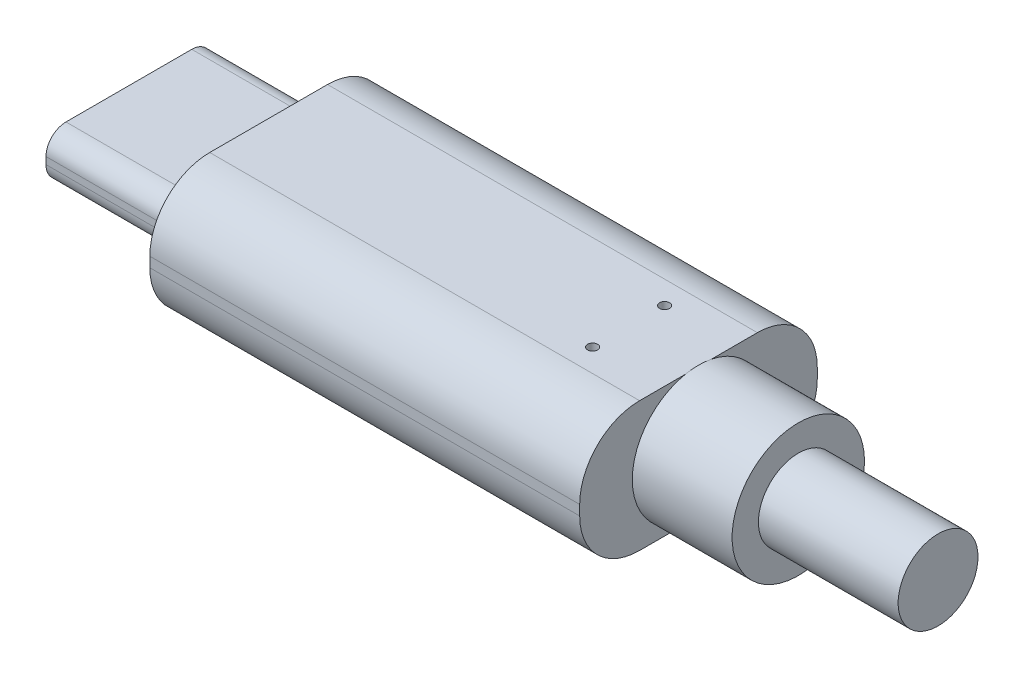
ISO-10303-21;
HEADER;
FILE_DESCRIPTION(('STEP AP214'),'2;1');
FILE_NAME('part.step','',(''),(''),'','','');
FILE_SCHEMA(('AUTOMOTIVE_DESIGN { 1 0 10303 214 1 1 1 1 }'));
ENDSEC;
DATA;
#1=APPLICATION_CONTEXT('core data for automotive mechanical design processes');
#2=APPLICATION_PROTOCOL_DEFINITION('international standard','automotive_design',2000,#1);
#3=PRODUCT_CONTEXT('',#1,'mechanical');
#4=PRODUCT('Part','Part','',(#3));
#5=PRODUCT_RELATED_PRODUCT_CATEGORY('part','',(#4));
#6=PRODUCT_DEFINITION_FORMATION('','',#4);
#7=PRODUCT_DEFINITION_CONTEXT('part definition',#1,'design');
#8=PRODUCT_DEFINITION('design','',#6,#7);
#9=PRODUCT_DEFINITION_SHAPE('','',#8);
#10=(LENGTH_UNIT() NAMED_UNIT(*) SI_UNIT(.MILLI.,.METRE.));
#11=(NAMED_UNIT(*) PLANE_ANGLE_UNIT() SI_UNIT($,.RADIAN.));
#12=(NAMED_UNIT(*) SI_UNIT($,.STERADIAN.) SOLID_ANGLE_UNIT());
#13=UNCERTAINTY_MEASURE_WITH_UNIT(LENGTH_MEASURE(1.E-05),#10,'distance_accuracy_value','');
#14=(GEOMETRIC_REPRESENTATION_CONTEXT(3) GLOBAL_UNCERTAINTY_ASSIGNED_CONTEXT((#13)) GLOBAL_UNIT_ASSIGNED_CONTEXT((#10,
#11,#12)) REPRESENTATION_CONTEXT('',''));
#15=CARTESIAN_POINT('',(0.,0.,0.));
#16=DIRECTION('',(0.,0.,1.));
#17=DIRECTION('',(1.,0.,0.));
#18=AXIS2_PLACEMENT_3D('',#15,#16,#17);
#19=CARTESIAN_POINT('',(-10.765,0.,5.95));
#20=DIRECTION('',(0.,0.,1.));
#21=DIRECTION('',(1.,0.,0.));
#22=AXIS2_PLACEMENT_3D('',#19,#20,#21);
#23=PLANE('',#22);
#24=DIRECTION('',(-1.,0.,0.));
#25=VECTOR('',#24,1.);
#26=CARTESIAN_POINT('',(-5.3825,3.,5.95));
#27=LINE('',#26,#25);
#28=CARTESIAN_POINT('',(10.765,3.,5.95));
#29=VERTEX_POINT('',#28);
#30=CARTESIAN_POINT('',(-10.765,3.,5.95));
#31=VERTEX_POINT('',#30);
#32=EDGE_CURVE('E207',#29,#31,#27,.T.);
#33=ORIENTED_EDGE('',*,*,#32,.F.);
#34=DIRECTION('',(0.,1.,0.));
#35=VECTOR('',#34,1.);
#36=CARTESIAN_POINT('',(10.765,0.,5.95));
#37=LINE('',#36,#35);
#38=CARTESIAN_POINT('',(10.765,3.5,5.95));
#39=VERTEX_POINT('',#38);
#40=EDGE_CURVE('E11',#29,#39,#37,.T.);
#41=ORIENTED_EDGE('',*,*,#40,.T.);
#42=DIRECTION('',(1.,0.,0.));
#43=VECTOR('',#42,1.);
#44=CARTESIAN_POINT('',(-5.3825,3.5,5.95));
#45=LINE('',#44,#43);
#46=CARTESIAN_POINT('',(-10.765,3.5,5.95));
#47=VERTEX_POINT('',#46);
#48=EDGE_CURVE('E467',#47,#39,#45,.T.);
#49=ORIENTED_EDGE('',*,*,#48,.F.);
#50=DIRECTION('',(0.,1.,0.));
#51=VECTOR('',#50,1.);
#52=CARTESIAN_POINT('',(-10.765,0.,5.95));
#53=LINE('',#52,#51);
#54=EDGE_CURVE('E218',#31,#47,#53,.T.);
#55=ORIENTED_EDGE('',*,*,#54,.F.);
#56=EDGE_LOOP('',(#33,#41,#49,#55));
#57=FACE_BOUND('',#56,.T.);
#58=ADVANCED_FACE('F17',(#57),#23,.T.);
#59=CARTESIAN_POINT('',(10.765,0.,-5.95));
#60=DIRECTION('',(0.,0.,-1.));
#61=DIRECTION('',(0.,-1.,0.));
#62=AXIS2_PLACEMENT_3D('',#59,#60,#61);
#63=PLANE('',#62);
#64=DIRECTION('',(1.,0.,0.));
#65=VECTOR('',#64,1.);
#66=CARTESIAN_POINT('',(5.3825,3.,-5.95));
#67=LINE('',#66,#65);
#68=CARTESIAN_POINT('',(-10.765,3.,-5.95));
#69=VERTEX_POINT('',#68);
#70=CARTESIAN_POINT('',(10.765,3.,-5.95));
#71=VERTEX_POINT('',#70);
#72=EDGE_CURVE('E224',#69,#71,#67,.T.);
#73=ORIENTED_EDGE('',*,*,#72,.F.);
#74=DIRECTION('',(0.,1.,0.));
#75=VECTOR('',#74,1.);
#76=CARTESIAN_POINT('',(-10.765,0.,-5.95));
#77=LINE('',#76,#75);
#78=CARTESIAN_POINT('',(-10.765,3.5,-5.95));
#79=VERTEX_POINT('',#78);
#80=EDGE_CURVE('E212',#69,#79,#77,.T.);
#81=ORIENTED_EDGE('',*,*,#80,.T.);
#82=DIRECTION('',(-1.,0.,0.));
#83=VECTOR('',#82,1.);
#84=CARTESIAN_POINT('',(5.3825,3.5,-5.95));
#85=LINE('',#84,#83);
#86=CARTESIAN_POINT('',(10.765,3.5,-5.95));
#87=VERTEX_POINT('',#86);
#88=EDGE_CURVE('E326',#87,#79,#85,.T.);
#89=ORIENTED_EDGE('',*,*,#88,.F.);
#90=DIRECTION('',(0.,1.,0.));
#91=VECTOR('',#90,1.);
#92=CARTESIAN_POINT('',(10.765,0.,-5.95));
#93=LINE('',#92,#91);
#94=EDGE_CURVE('E219',#71,#87,#93,.T.);
#95=ORIENTED_EDGE('',*,*,#94,.F.);
#96=EDGE_LOOP('',(#73,#81,#89,#95));
#97=FACE_BOUND('',#96,.T.);
#98=ADVANCED_FACE('F383',(#97),#63,.T.);
#99=CARTESIAN_POINT('',(10.765,0.,5.95));
#100=DIRECTION('',(1.,0.,0.));
#101=DIRECTION('',(0.,0.,-1.));
#102=AXIS2_PLACEMENT_3D('',#99,#100,#101);
#103=PLANE('',#102);
#104=CARTESIAN_POINT('',(10.765,3.,2.95));
#105=DIRECTION('',(-1.,0.,0.));
#106=DIRECTION('',(0.,-0.707106781186548,0.707106781186548));
#107=AXIS2_PLACEMENT_3D('',#104,#105,#106);
#108=CIRCLE('',#107,3.);
#109=CARTESIAN_POINT('',(10.765,0.,2.95));
#110=VERTEX_POINT('',#109);
#111=EDGE_CURVE('E203',#110,#29,#108,.T.);
#112=ORIENTED_EDGE('',*,*,#111,.F.);
#113=DIRECTION('',(0.,0.,1.));
#114=VECTOR('',#113,1.);
#115=CARTESIAN_POINT('',(10.765,0.,-5.95));
#116=LINE('',#115,#114);
#117=CARTESIAN_POINT('',(10.765,0.,0.653241915372859));
#118=VERTEX_POINT('',#117);
#119=EDGE_CURVE('E317',#118,#110,#116,.T.);
#120=ORIENTED_EDGE('',*,*,#119,.F.);
#121=CARTESIAN_POINT('',(10.765,3.25,0.));
#122=DIRECTION('',(-1.,0.,0.));
#123=DIRECTION('',(0.,0.,1.));
#124=AXIS2_PLACEMENT_3D('',#121,#122,#123);
#125=CIRCLE('',#124,3.315);
#126=CARTESIAN_POINT('',(10.765,6.5,0.653241915372859));
#127=VERTEX_POINT('',#126);
#128=EDGE_CURVE('E28',#118,#127,#125,.T.);
#129=ORIENTED_EDGE('',*,*,#128,.T.);
#130=DIRECTION('',(0.,0.,-1.));
#131=VECTOR('',#130,1.);
#132=CARTESIAN_POINT('',(10.765,6.5,-5.95));
#133=LINE('',#132,#131);
#134=CARTESIAN_POINT('',(10.765,6.5,2.95));
#135=VERTEX_POINT('',#134);
#136=EDGE_CURVE('E419',#135,#127,#133,.T.);
#137=ORIENTED_EDGE('',*,*,#136,.F.);
#138=CARTESIAN_POINT('',(10.765,3.5,2.95));
#139=DIRECTION('',(-1.,0.,0.));
#140=DIRECTION('',(0.,0.707106781186548,0.707106781186548));
#141=AXIS2_PLACEMENT_3D('',#138,#139,#140);
#142=CIRCLE('',#141,3.);
#143=EDGE_CURVE('E421',#39,#135,#142,.T.);
#144=ORIENTED_EDGE('',*,*,#143,.F.);
#145=ORIENTED_EDGE('',*,*,#40,.F.);
#146=EDGE_LOOP('',(#112,#120,#129,#137,#144,#145));
#147=FACE_BOUND('',#146,.T.);
#148=ADVANCED_FACE('F465',(#147),#103,.T.);
#149=CARTESIAN_POINT('',(15.765,3.25,0.));
#150=DIRECTION('',(1.,0.,0.));
#151=DIRECTION('',(0.,0.,-1.));
#152=AXIS2_PLACEMENT_3D('',#149,#150,#151);
#153=PLANE('',#152);
#154=CARTESIAN_POINT('',(15.765,3.25,0.));
#155=DIRECTION('',(-1.,0.,0.));
#156=DIRECTION('',(0.,0.,1.));
#157=AXIS2_PLACEMENT_3D('',#154,#155,#156);
#158=CIRCLE('',#157,2.);
#159=CARTESIAN_POINT('',(15.765,3.25,-2.));
#160=VERTEX_POINT('',#159);
#161=EDGE_CURVE('E338',#160,#160,#158,.T.);
#162=ORIENTED_EDGE('',*,*,#161,.T.);
#163=EDGE_LOOP('',(#162));
#164=FACE_BOUND('',#163,.T.);
#165=CARTESIAN_POINT('',(15.765,3.25,0.));
#166=DIRECTION('',(1.,0.,0.));
#167=DIRECTION('',(0.,0.,1.));
#168=AXIS2_PLACEMENT_3D('',#165,#166,#167);
#169=CIRCLE('',#168,3.315);
#170=CARTESIAN_POINT('',(15.765,3.25,-3.315));
#171=VERTEX_POINT('',#170);
#172=EDGE_CURVE('E277',#171,#171,#169,.T.);
#173=ORIENTED_EDGE('',*,*,#172,.T.);
#174=EDGE_LOOP('',(#173));
#175=FACE_BOUND('',#174,.T.);
#176=ADVANCED_FACE('F550',(#164,#175),#153,.T.);
#177=CARTESIAN_POINT('',(10.765,3.25,0.));
#178=DIRECTION('',(1.,0.,0.));
#179=DIRECTION('',(0.,0.,1.));
#180=AXIS2_PLACEMENT_3D('',#177,#178,#179);
#181=CYLINDRICAL_SURFACE('',#180,3.315);
#182=ORIENTED_EDGE('',*,*,#172,.F.);
#183=DIRECTION('',(-1.,0.,0.));
#184=VECTOR('',#183,1.);
#185=CARTESIAN_POINT('',(10.765,3.25,-3.315));
#186=LINE('',#185,#184);
#187=CARTESIAN_POINT('',(10.765,3.25,-3.315));
#188=VERTEX_POINT('',#187);
#189=EDGE_CURVE('E42',#171,#188,#186,.T.);
#190=ORIENTED_EDGE('',*,*,#189,.T.);
#191=CARTESIAN_POINT('',(10.765,3.25,0.));
#192=DIRECTION('',(-1.,0.,0.));
#193=DIRECTION('',(0.,0.,1.));
#194=AXIS2_PLACEMENT_3D('',#191,#192,#193);
#195=CIRCLE('',#194,3.315);
#196=CARTESIAN_POINT('',(10.765,6.5,-0.653241915372857));
#197=VERTEX_POINT('',#196);
#198=EDGE_CURVE('E321',#197,#188,#195,.T.);
#199=ORIENTED_EDGE('',*,*,#198,.F.);
#200=CARTESIAN_POINT('',(10.765,3.25,0.));
#201=DIRECTION('',(-1.,0.,0.));
#202=DIRECTION('',(0.,0.,1.));
#203=AXIS2_PLACEMENT_3D('',#200,#201,#202);
#204=CIRCLE('',#203,3.315);
#205=EDGE_CURVE('E278',#127,#197,#204,.T.);
#206=ORIENTED_EDGE('',*,*,#205,.F.);
#207=ORIENTED_EDGE('',*,*,#128,.F.);
#208=CARTESIAN_POINT('',(10.765,3.25,0.));
#209=DIRECTION('',(-1.,0.,0.));
#210=DIRECTION('',(0.,0.,1.));
#211=AXIS2_PLACEMENT_3D('',#208,#209,#210);
#212=CIRCLE('',#211,3.315);
#213=CARTESIAN_POINT('',(10.765,0.,-0.653241915372857));
#214=VERTEX_POINT('',#213);
#215=EDGE_CURVE('E273',#214,#118,#212,.T.);
#216=ORIENTED_EDGE('',*,*,#215,.F.);
#217=CARTESIAN_POINT('',(10.765,3.25,0.));
#218=DIRECTION('',(-1.,0.,0.));
#219=DIRECTION('',(0.,0.,1.));
#220=AXIS2_PLACEMENT_3D('',#217,#218,#219);
#221=CIRCLE('',#220,3.315);
#222=EDGE_CURVE('E325',#188,#214,#221,.T.);
#223=ORIENTED_EDGE('',*,*,#222,.F.);
#224=ORIENTED_EDGE('',*,*,#189,.F.);
#225=EDGE_LOOP('',(#182,#190,#199,#206,#207,#216,#223,#224));
#226=FACE_BOUND('',#225,.T.);
#227=ADVANCED_FACE('F409',(#226),#181,.T.);
#228=CARTESIAN_POINT('',(10.765,3.25,0.));
#229=DIRECTION('',(1.,0.,0.));
#230=DIRECTION('',(0.,0.,-1.));
#231=AXIS2_PLACEMENT_3D('',#228,#229,#230);
#232=PLANE('',#231);
#233=DIRECTION('',(0.,0.,1.));
#234=VECTOR('',#233,1.);
#235=CARTESIAN_POINT('',(10.765,0.,-5.95));
#236=LINE('',#235,#234);
#237=EDGE_CURVE('E250',#214,#118,#236,.T.);
#238=ORIENTED_EDGE('',*,*,#237,.F.);
#239=ORIENTED_EDGE('',*,*,#215,.T.);
#240=EDGE_LOOP('',(#238,#239));
#241=FACE_BOUND('',#240,.T.);
#242=ADVANCED_FACE('F549',(#241),#232,.F.);
#243=CARTESIAN_POINT('',(10.765,3.25,0.));
#244=DIRECTION('',(1.,0.,0.));
#245=DIRECTION('',(0.,0.,-1.));
#246=AXIS2_PLACEMENT_3D('',#243,#244,#245);
#247=PLANE('',#246);
#248=DIRECTION('',(0.,0.,-1.));
#249=VECTOR('',#248,1.);
#250=CARTESIAN_POINT('',(10.765,6.5,-5.95));
#251=LINE('',#250,#249);
#252=EDGE_CURVE('E245',#127,#197,#251,.T.);
#253=ORIENTED_EDGE('',*,*,#252,.F.);
#254=ORIENTED_EDGE('',*,*,#205,.T.);
#255=EDGE_LOOP('',(#253,#254));
#256=FACE_BOUND('',#255,.T.);
#257=ADVANCED_FACE('F554',(#256),#247,.F.);
#258=CARTESIAN_POINT('',(-10.765,2.075,4.15));
#259=DIRECTION('',(0.,0.,1.));
#260=DIRECTION('',(1.,0.,0.));
#261=AXIS2_PLACEMENT_3D('',#258,#259,#260);
#262=PLANE('',#261);
#263=DIRECTION('',(-1.,0.,0.));
#264=VECTOR('',#263,1.);
#265=CARTESIAN_POINT('',(-10.765,3.075,4.15));
#266=LINE('',#265,#264);
#267=CARTESIAN_POINT('',(-10.765,3.075,4.15));
#268=VERTEX_POINT('',#267);
#269=CARTESIAN_POINT('',(-17.765,3.075,4.15));
#270=VERTEX_POINT('',#269);
#271=EDGE_CURVE('E198',#268,#270,#266,.T.);
#272=ORIENTED_EDGE('',*,*,#271,.F.);
#273=DIRECTION('',(0.,-1.,0.));
#274=VECTOR('',#273,1.);
#275=CARTESIAN_POINT('',(-10.765,1.0375,4.15));
#276=LINE('',#275,#274);
#277=CARTESIAN_POINT('',(-10.765,3.425,4.15));
#278=VERTEX_POINT('',#277);
#279=EDGE_CURVE('E264',#278,#268,#276,.T.);
#280=ORIENTED_EDGE('',*,*,#279,.F.);
#281=DIRECTION('',(1.,0.,0.));
#282=VECTOR('',#281,1.);
#283=CARTESIAN_POINT('',(-10.765,3.425,4.15));
#284=LINE('',#283,#282);
#285=CARTESIAN_POINT('',(-17.765,3.425,4.15));
#286=VERTEX_POINT('',#285);
#287=EDGE_CURVE('E201',#286,#278,#284,.T.);
#288=ORIENTED_EDGE('',*,*,#287,.F.);
#289=DIRECTION('',(0.,1.,0.));
#290=VECTOR('',#289,1.);
#291=CARTESIAN_POINT('',(-17.765,2.075,4.15));
#292=LINE('',#291,#290);
#293=EDGE_CURVE('E344',#270,#286,#292,.T.);
#294=ORIENTED_EDGE('',*,*,#293,.F.);
#295=EDGE_LOOP('',(#272,#280,#288,#294));
#296=FACE_BOUND('',#295,.T.);
#297=ADVANCED_FACE('F557',(#296),#262,.T.);
#298=CARTESIAN_POINT('',(-10.765,4.425,-4.15));
#299=DIRECTION('',(0.,0.,-1.));
#300=DIRECTION('',(0.,-1.,0.));
#301=AXIS2_PLACEMENT_3D('',#298,#299,#300);
#302=PLANE('',#301);
#303=DIRECTION('',(-1.,0.,0.));
#304=VECTOR('',#303,1.);
#305=CARTESIAN_POINT('',(-10.765,3.425,-4.15));
#306=LINE('',#305,#304);
#307=CARTESIAN_POINT('',(-10.765,3.425,-4.15));
#308=VERTEX_POINT('',#307);
#309=CARTESIAN_POINT('',(-17.765,3.425,-4.15));
#310=VERTEX_POINT('',#309);
#311=EDGE_CURVE('E282',#308,#310,#306,.T.);
#312=ORIENTED_EDGE('',*,*,#311,.F.);
#313=DIRECTION('',(0.,1.,0.));
#314=VECTOR('',#313,1.);
#315=CARTESIAN_POINT('',(-10.765,2.2125,-4.15));
#316=LINE('',#315,#314);
#317=CARTESIAN_POINT('',(-10.765,3.075,-4.15));
#318=VERTEX_POINT('',#317);
#319=EDGE_CURVE('E233',#318,#308,#316,.T.);
#320=ORIENTED_EDGE('',*,*,#319,.F.);
#321=DIRECTION('',(1.,0.,0.));
#322=VECTOR('',#321,1.);
#323=CARTESIAN_POINT('',(-10.765,3.075,-4.15));
#324=LINE('',#323,#322);
#325=CARTESIAN_POINT('',(-17.765,3.075,-4.15));
#326=VERTEX_POINT('',#325);
#327=EDGE_CURVE('E256',#326,#318,#324,.T.);
#328=ORIENTED_EDGE('',*,*,#327,.F.);
#329=DIRECTION('',(0.,-1.,0.));
#330=VECTOR('',#329,1.);
#331=CARTESIAN_POINT('',(-17.765,4.425,-4.15));
#332=LINE('',#331,#330);
#333=EDGE_CURVE('E292',#310,#326,#332,.T.);
#334=ORIENTED_EDGE('',*,*,#333,.F.);
#335=EDGE_LOOP('',(#312,#320,#328,#334));
#336=FACE_BOUND('',#335,.T.);
#337=ADVANCED_FACE('F559',(#336),#302,.T.);
#338=CARTESIAN_POINT('',(5.3825,3.5,-2.95));
#339=DIRECTION('',(-1.,0.,0.));
#340=DIRECTION('',(0.,0.707106781186547,-0.707106781186548));
#341=AXIS2_PLACEMENT_3D('',#338,#339,#340);
#342=CYLINDRICAL_SURFACE('',#341,3.);
#343=CARTESIAN_POINT('',(-10.765,3.5,-2.95));
#344=DIRECTION('',(1.,0.,0.));
#345=DIRECTION('',(0.,0.707106781186547,-0.707106781186548));
#346=AXIS2_PLACEMENT_3D('',#343,#344,#345);
#347=CIRCLE('',#346,3.);
#348=CARTESIAN_POINT('',(-10.765,6.5,-2.95));
#349=VERTEX_POINT('',#348);
#350=EDGE_CURVE('E208',#79,#349,#347,.T.);
#351=ORIENTED_EDGE('',*,*,#350,.T.);
#352=DIRECTION('',(1.,0.,0.));
#353=VECTOR('',#352,1.);
#354=CARTESIAN_POINT('',(5.3825,6.5,-2.95));
#355=LINE('',#354,#353);
#356=CARTESIAN_POINT('',(10.765,6.5,-2.95));
#357=VERTEX_POINT('',#356);
#358=EDGE_CURVE('E244',#349,#357,#355,.T.);
#359=ORIENTED_EDGE('',*,*,#358,.T.);
#360=CARTESIAN_POINT('',(10.765,3.5,-2.95));
#361=DIRECTION('',(-1.,0.,0.));
#362=DIRECTION('',(0.,0.707106781186547,-0.707106781186548));
#363=AXIS2_PLACEMENT_3D('',#360,#361,#362);
#364=CIRCLE('',#363,3.);
#365=EDGE_CURVE('E223',#357,#87,#364,.T.);
#366=ORIENTED_EDGE('',*,*,#365,.T.);
#367=ORIENTED_EDGE('',*,*,#88,.T.);
#368=EDGE_LOOP('',(#351,#359,#366,#367));
#369=FACE_BOUND('',#368,.T.);
#370=ADVANCED_FACE('F375',(#369),#342,.T.);
#371=CARTESIAN_POINT('',(10.765,0.,5.95));
#372=DIRECTION('',(1.,0.,0.));
#373=DIRECTION('',(0.,0.,-1.));
#374=AXIS2_PLACEMENT_3D('',#371,#372,#373);
#375=PLANE('',#374);
#376=CARTESIAN_POINT('',(10.765,3.,-2.95));
#377=DIRECTION('',(-1.,0.,0.));
#378=DIRECTION('',(0.,-0.707106781186547,-0.707106781186548));
#379=AXIS2_PLACEMENT_3D('',#376,#377,#378);
#380=CIRCLE('',#379,3.);
#381=CARTESIAN_POINT('',(10.765,0.,-2.95));
#382=VERTEX_POINT('',#381);
#383=EDGE_CURVE('E228',#71,#382,#380,.T.);
#384=ORIENTED_EDGE('',*,*,#383,.F.);
#385=ORIENTED_EDGE('',*,*,#94,.T.);
#386=ORIENTED_EDGE('',*,*,#365,.F.);
#387=DIRECTION('',(0.,0.,-1.));
#388=VECTOR('',#387,1.);
#389=CARTESIAN_POINT('',(10.765,6.5,-5.95));
#390=LINE('',#389,#388);
#391=EDGE_CURVE('E240',#197,#357,#390,.T.);
#392=ORIENTED_EDGE('',*,*,#391,.F.);
#393=ORIENTED_EDGE('',*,*,#198,.T.);
#394=ORIENTED_EDGE('',*,*,#222,.T.);
#395=DIRECTION('',(0.,0.,1.));
#396=VECTOR('',#395,1.);
#397=CARTESIAN_POINT('',(10.765,0.,-5.95));
#398=LINE('',#397,#396);
#399=EDGE_CURVE('E246',#382,#214,#398,.T.);
#400=ORIENTED_EDGE('',*,*,#399,.F.);
#401=EDGE_LOOP('',(#384,#385,#386,#392,#393,#394,#400));
#402=FACE_BOUND('',#401,.T.);
#403=ADVANCED_FACE('F379',(#402),#375,.T.);
#404=CARTESIAN_POINT('',(5.3825,3.,-2.95));
#405=DIRECTION('',(1.,0.,0.));
#406=DIRECTION('',(0.,-0.707106781186547,-0.707106781186548));
#407=AXIS2_PLACEMENT_3D('',#404,#405,#406);
#408=CYLINDRICAL_SURFACE('',#407,3.);
#409=ORIENTED_EDGE('',*,*,#383,.T.);
#410=DIRECTION('',(-1.,0.,0.));
#411=VECTOR('',#410,1.);
#412=CARTESIAN_POINT('',(5.3825,0.,-2.95));
#413=LINE('',#412,#411);
#414=CARTESIAN_POINT('',(-10.765,0.,-2.95));
#415=VERTEX_POINT('',#414);
#416=EDGE_CURVE('E251',#382,#415,#413,.T.);
#417=ORIENTED_EDGE('',*,*,#416,.T.);
#418=CARTESIAN_POINT('',(-10.765,3.,-2.95));
#419=DIRECTION('',(1.,0.,0.));
#420=DIRECTION('',(0.,-0.707106781186547,-0.707106781186548));
#421=AXIS2_PLACEMENT_3D('',#418,#419,#420);
#422=CIRCLE('',#421,3.);
#423=EDGE_CURVE('E229',#415,#69,#422,.T.);
#424=ORIENTED_EDGE('',*,*,#423,.T.);
#425=ORIENTED_EDGE('',*,*,#72,.T.);
#426=EDGE_LOOP('',(#409,#417,#424,#425));
#427=FACE_BOUND('',#426,.T.);
#428=ADVANCED_FACE('F385',(#427),#408,.T.);
#429=CARTESIAN_POINT('',(0.,6.5,0.));
#430=DIRECTION('',(0.,1.,0.));
#431=DIRECTION('',(1.,0.,0.));
#432=AXIS2_PLACEMENT_3D('',#429,#430,#431);
#433=PLANE('',#432);
#434=CARTESIAN_POINT('',(7.265,6.5,-1.80162095768643));
#435=DIRECTION('',(0.,-1.,0.));
#436=DIRECTION('',(-1.,0.,0.));
#437=AXIS2_PLACEMENT_3D('',#434,#435,#436);
#438=CIRCLE('',#437,0.25);
#439=CARTESIAN_POINT('',(7.515,6.5,-1.80162095768643));
#440=VERTEX_POINT('',#439);
#441=EDGE_CURVE('E192',#440,#440,#438,.T.);
#442=ORIENTED_EDGE('',*,*,#441,.T.);
#443=EDGE_LOOP('',(#442));
#444=FACE_BOUND('',#443,.T.);
#445=CARTESIAN_POINT('',(7.265,6.5,1.80162095768643));
#446=DIRECTION('',(0.,-1.,0.));
#447=DIRECTION('',(-1.,0.,0.));
#448=AXIS2_PLACEMENT_3D('',#445,#446,#447);
#449=CIRCLE('',#448,0.25);
#450=CARTESIAN_POINT('',(7.515,6.5,1.80162095768643));
#451=VERTEX_POINT('',#450);
#452=EDGE_CURVE('E239',#451,#451,#449,.T.);
#453=ORIENTED_EDGE('',*,*,#452,.T.);
#454=EDGE_LOOP('',(#453));
#455=FACE_BOUND('',#454,.T.);
#456=DIRECTION('',(-1.,0.,0.));
#457=VECTOR('',#456,1.);
#458=CARTESIAN_POINT('',(-5.3825,6.5,2.95));
#459=LINE('',#458,#457);
#460=CARTESIAN_POINT('',(-10.765,6.5,2.95));
#461=VERTEX_POINT('',#460);
#462=EDGE_CURVE('E21',#135,#461,#459,.T.);
#463=ORIENTED_EDGE('',*,*,#462,.F.);
#464=ORIENTED_EDGE('',*,*,#136,.T.);
#465=ORIENTED_EDGE('',*,*,#252,.T.);
#466=ORIENTED_EDGE('',*,*,#391,.T.);
#467=ORIENTED_EDGE('',*,*,#358,.F.);
#468=DIRECTION('',(0.,0.,1.));
#469=VECTOR('',#468,1.);
#470=CARTESIAN_POINT('',(-10.765,6.5,5.95));
#471=LINE('',#470,#469);
#472=EDGE_CURVE('E213',#349,#461,#471,.T.);
#473=ORIENTED_EDGE('',*,*,#472,.T.);
#474=EDGE_LOOP('',(#463,#464,#465,#466,#467,#473));
#475=FACE_BOUND('',#474,.T.);
#476=ADVANCED_FACE('F400',(#444,#455,#475),#433,.T.);
#477=CARTESIAN_POINT('',(-5.3825,3.5,2.95));
#478=DIRECTION('',(1.,0.,0.));
#479=DIRECTION('',(0.,0.707106781186548,0.707106781186548));
#480=AXIS2_PLACEMENT_3D('',#477,#478,#479);
#481=CYLINDRICAL_SURFACE('',#480,3.);
#482=ORIENTED_EDGE('',*,*,#143,.T.);
#483=ORIENTED_EDGE('',*,*,#462,.T.);
#484=CARTESIAN_POINT('',(-10.765,3.5,2.95));
#485=DIRECTION('',(1.,0.,0.));
#486=DIRECTION('',(0.,0.707106781186548,0.707106781186548));
#487=AXIS2_PLACEMENT_3D('',#484,#485,#486);
#488=CIRCLE('',#487,3.);
#489=EDGE_CURVE('E214',#461,#47,#488,.T.);
#490=ORIENTED_EDGE('',*,*,#489,.T.);
#491=ORIENTED_EDGE('',*,*,#48,.T.);
#492=EDGE_LOOP('',(#482,#483,#490,#491));
#493=FACE_BOUND('',#492,.T.);
#494=ADVANCED_FACE('F512',(#493),#481,.T.);
#495=CARTESIAN_POINT('',(-10.765,0.,-5.95));
#496=DIRECTION('',(-1.,0.,0.));
#497=DIRECTION('',(0.,0.,1.));
#498=AXIS2_PLACEMENT_3D('',#495,#496,#497);
#499=PLANE('',#498);
#500=ORIENTED_EDGE('',*,*,#319,.T.);
#501=CARTESIAN_POINT('',(-10.765,3.425,-3.15));
#502=DIRECTION('',(-1.,0.,0.));
#503=DIRECTION('',(0.,0.707106781186548,-0.707106781186548));
#504=AXIS2_PLACEMENT_3D('',#501,#502,#503);
#505=CIRCLE('',#504,1.);
#506=CARTESIAN_POINT('',(-10.765,4.425,-3.15));
#507=VERTEX_POINT('',#506);
#508=EDGE_CURVE('E271',#507,#308,#505,.T.);
#509=ORIENTED_EDGE('',*,*,#508,.F.);
#510=DIRECTION('',(0.,0.,1.));
#511=VECTOR('',#510,1.);
#512=CARTESIAN_POINT('',(-10.765,4.425,-0.9));
#513=LINE('',#512,#511);
#514=CARTESIAN_POINT('',(-10.765,4.425,3.15));
#515=VERTEX_POINT('',#514);
#516=EDGE_CURVE('E363',#507,#515,#513,.T.);
#517=ORIENTED_EDGE('',*,*,#516,.T.);
#518=CARTESIAN_POINT('',(-10.765,3.425,3.15));
#519=DIRECTION('',(-1.,0.,0.));
#520=DIRECTION('',(0.,0.707106781186548,0.707106781186547));
#521=AXIS2_PLACEMENT_3D('',#518,#519,#520);
#522=CIRCLE('',#521,1.);
#523=EDGE_CURVE('E261',#278,#515,#522,.T.);
#524=ORIENTED_EDGE('',*,*,#523,.F.);
#525=ORIENTED_EDGE('',*,*,#279,.T.);
#526=CARTESIAN_POINT('',(-10.765,3.075,3.15));
#527=DIRECTION('',(-1.,0.,0.));
#528=DIRECTION('',(0.,-0.707106781186548,0.707106781186548));
#529=AXIS2_PLACEMENT_3D('',#526,#527,#528);
#530=CIRCLE('',#529,1.);
#531=CARTESIAN_POINT('',(-10.765,2.075,3.15));
#532=VERTEX_POINT('',#531);
#533=EDGE_CURVE('E202',#532,#268,#530,.T.);
#534=ORIENTED_EDGE('',*,*,#533,.F.);
#535=DIRECTION('',(0.,0.,-1.));
#536=VECTOR('',#535,1.);
#537=CARTESIAN_POINT('',(-10.765,2.075,-5.05));
#538=LINE('',#537,#536);
#539=CARTESIAN_POINT('',(-10.765,2.075,-3.15));
#540=VERTEX_POINT('',#539);
#541=EDGE_CURVE('E307',#532,#540,#538,.T.);
#542=ORIENTED_EDGE('',*,*,#541,.T.);
#543=CARTESIAN_POINT('',(-10.765,3.075,-3.15));
#544=DIRECTION('',(-1.,0.,0.));
#545=DIRECTION('',(0.,-0.707106781186548,-0.707106781186548));
#546=AXIS2_PLACEMENT_3D('',#543,#544,#545);
#547=CIRCLE('',#546,1.);
#548=EDGE_CURVE('E252',#318,#540,#547,.T.);
#549=ORIENTED_EDGE('',*,*,#548,.F.);
#550=EDGE_LOOP('',(#500,#509,#517,#524,#525,#534,#542,#549));
#551=FACE_BOUND('',#550,.T.);
#552=CARTESIAN_POINT('',(-10.765,3.,2.95));
#553=DIRECTION('',(1.,0.,0.));
#554=DIRECTION('',(0.,-0.707106781186548,0.707106781186548));
#555=AXIS2_PLACEMENT_3D('',#552,#553,#554);
#556=CIRCLE('',#555,3.);
#557=CARTESIAN_POINT('',(-10.765,0.,2.95));
#558=VERTEX_POINT('',#557);
#559=EDGE_CURVE('E181',#31,#558,#556,.T.);
#560=ORIENTED_EDGE('',*,*,#559,.F.);
#561=ORIENTED_EDGE('',*,*,#54,.T.);
#562=ORIENTED_EDGE('',*,*,#489,.F.);
#563=ORIENTED_EDGE('',*,*,#472,.F.);
#564=ORIENTED_EDGE('',*,*,#350,.F.);
#565=ORIENTED_EDGE('',*,*,#80,.F.);
#566=ORIENTED_EDGE('',*,*,#423,.F.);
#567=DIRECTION('',(0.,0.,-1.));
#568=VECTOR('',#567,1.);
#569=CARTESIAN_POINT('',(-10.765,0.,5.95));
#570=LINE('',#569,#568);
#571=EDGE_CURVE('E331',#558,#415,#570,.T.);
#572=ORIENTED_EDGE('',*,*,#571,.F.);
#573=EDGE_LOOP('',(#560,#561,#562,#563,#564,#565,#566,#572));
#574=FACE_BOUND('',#573,.T.);
#575=ADVANCED_FACE('F394',(#551,#574),#499,.T.);
#576=CARTESIAN_POINT('',(0.,0.,0.));
#577=DIRECTION('',(0.,-1.,0.));
#578=DIRECTION('',(0.,0.,-1.));
#579=AXIS2_PLACEMENT_3D('',#576,#577,#578);
#580=PLANE('',#579);
#581=CARTESIAN_POINT('',(7.265,0.,-1.80162095768643));
#582=DIRECTION('',(0.,1.,0.));
#583=DIRECTION('',(-1.,0.,0.));
#584=AXIS2_PLACEMENT_3D('',#581,#582,#583);
#585=CIRCLE('',#584,0.25);
#586=CARTESIAN_POINT('',(7.515,0.,-1.80162095768643));
#587=VERTEX_POINT('',#586);
#588=EDGE_CURVE('E175',#587,#587,#585,.T.);
#589=ORIENTED_EDGE('',*,*,#588,.T.);
#590=EDGE_LOOP('',(#589));
#591=FACE_BOUND('',#590,.T.);
#592=CARTESIAN_POINT('',(7.265,0.,1.80162095768643));
#593=DIRECTION('',(0.,1.,0.));
#594=DIRECTION('',(-1.,0.,0.));
#595=AXIS2_PLACEMENT_3D('',#592,#593,#594);
#596=CIRCLE('',#595,0.25);
#597=CARTESIAN_POINT('',(7.515,0.,1.80162095768643));
#598=VERTEX_POINT('',#597);
#599=EDGE_CURVE('E238',#598,#598,#596,.T.);
#600=ORIENTED_EDGE('',*,*,#599,.T.);
#601=EDGE_LOOP('',(#600));
#602=FACE_BOUND('',#601,.T.);
#603=DIRECTION('',(1.,0.,0.));
#604=VECTOR('',#603,1.);
#605=CARTESIAN_POINT('',(-5.3825,0.,2.95));
#606=LINE('',#605,#604);
#607=EDGE_CURVE('E189',#558,#110,#606,.T.);
#608=ORIENTED_EDGE('',*,*,#607,.F.);
#609=ORIENTED_EDGE('',*,*,#571,.T.);
#610=ORIENTED_EDGE('',*,*,#416,.F.);
#611=ORIENTED_EDGE('',*,*,#399,.T.);
#612=ORIENTED_EDGE('',*,*,#237,.T.);
#613=ORIENTED_EDGE('',*,*,#119,.T.);
#614=EDGE_LOOP('',(#608,#609,#610,#611,#612,#613));
#615=FACE_BOUND('',#614,.T.);
#616=ADVANCED_FACE('F176',(#591,#602,#615),#580,.T.);
#617=CARTESIAN_POINT('',(-5.3825,3.,2.95));
#618=DIRECTION('',(-1.,0.,0.));
#619=DIRECTION('',(0.,-0.707106781186548,0.707106781186548));
#620=AXIS2_PLACEMENT_3D('',#617,#618,#619);
#621=CYLINDRICAL_SURFACE('',#620,3.);
#622=ORIENTED_EDGE('',*,*,#559,.T.);
#623=ORIENTED_EDGE('',*,*,#607,.T.);
#624=ORIENTED_EDGE('',*,*,#111,.T.);
#625=ORIENTED_EDGE('',*,*,#32,.T.);
#626=EDGE_LOOP('',(#622,#623,#624,#625));
#627=FACE_BOUND('',#626,.T.);
#628=ADVANCED_FACE('F565',(#627),#621,.T.);
#629=CARTESIAN_POINT('',(7.265,6.5,-1.80162095768643));
#630=DIRECTION('',(0.,-1.,0.));
#631=DIRECTION('',(-1.,0.,0.));
#632=AXIS2_PLACEMENT_3D('',#629,#630,#631);
#633=CYLINDRICAL_SURFACE('',#632,0.25);
#634=ORIENTED_EDGE('',*,*,#441,.F.);
#635=DIRECTION('',(0.,-1.,0.));
#636=VECTOR('',#635,1.);
#637=CARTESIAN_POINT('',(7.515,6.5,-1.80162095768643));
#638=LINE('',#637,#636);
#639=EDGE_CURVE('E182',#440,#587,#638,.T.);
#640=ORIENTED_EDGE('',*,*,#639,.T.);
#641=ORIENTED_EDGE('',*,*,#588,.F.);
#642=ORIENTED_EDGE('',*,*,#639,.F.);
#643=EDGE_LOOP('',(#634,#640,#641,#642));
#644=FACE_BOUND('',#643,.T.);
#645=ADVANCED_FACE('F19',(#644),#633,.F.);
#646=CARTESIAN_POINT('',(7.265,6.5,1.80162095768643));
#647=DIRECTION('',(0.,-1.,0.));
#648=DIRECTION('',(-1.,0.,0.));
#649=AXIS2_PLACEMENT_3D('',#646,#647,#648);
#650=CYLINDRICAL_SURFACE('',#649,0.25);
#651=ORIENTED_EDGE('',*,*,#452,.F.);
#652=DIRECTION('',(0.,-1.,0.));
#653=VECTOR('',#652,1.);
#654=CARTESIAN_POINT('',(7.515,6.5,1.80162095768643));
#655=LINE('',#654,#653);
#656=EDGE_CURVE('E234',#451,#598,#655,.T.);
#657=ORIENTED_EDGE('',*,*,#656,.T.);
#658=ORIENTED_EDGE('',*,*,#599,.F.);
#659=ORIENTED_EDGE('',*,*,#656,.F.);
#660=EDGE_LOOP('',(#651,#657,#658,#659));
#661=FACE_BOUND('',#660,.T.);
#662=ADVANCED_FACE('F509',(#661),#650,.F.);
#663=CARTESIAN_POINT('',(-10.765,3.425,3.15));
#664=DIRECTION('',(-1.,0.,0.));
#665=DIRECTION('',(0.,0.707106781186548,0.707106781186547));
#666=AXIS2_PLACEMENT_3D('',#663,#664,#665);
#667=CYLINDRICAL_SURFACE('',#666,1.);
#668=CARTESIAN_POINT('',(-17.765,3.425,3.15));
#669=DIRECTION('',(1.,0.,0.));
#670=DIRECTION('',(0.,0.707106781186548,0.707106781186547));
#671=AXIS2_PLACEMENT_3D('',#668,#669,#670);
#672=CIRCLE('',#671,1.);
#673=CARTESIAN_POINT('',(-17.765,4.425,3.15));
#674=VERTEX_POINT('',#673);
#675=EDGE_CURVE('E196',#674,#286,#672,.T.);
#676=ORIENTED_EDGE('',*,*,#675,.T.);
#677=ORIENTED_EDGE('',*,*,#287,.T.);
#678=ORIENTED_EDGE('',*,*,#523,.T.);
#679=DIRECTION('',(-1.,0.,0.));
#680=VECTOR('',#679,1.);
#681=CARTESIAN_POINT('',(-10.765,4.425,3.15));
#682=LINE('',#681,#680);
#683=EDGE_CURVE('E367',#515,#674,#682,.T.);
#684=ORIENTED_EDGE('',*,*,#683,.T.);
#685=EDGE_LOOP('',(#676,#677,#678,#684));
#686=FACE_BOUND('',#685,.T.);
#687=ADVANCED_FACE('F590',(#686),#667,.T.);
#688=CARTESIAN_POINT('',(-10.765,3.075,3.15));
#689=DIRECTION('',(-1.,0.,0.));
#690=DIRECTION('',(0.,-0.707106781186548,0.707106781186548));
#691=AXIS2_PLACEMENT_3D('',#688,#689,#690);
#692=CYLINDRICAL_SURFACE('',#691,1.);
#693=CARTESIAN_POINT('',(-17.765,3.075,3.15));
#694=DIRECTION('',(1.,0.,0.));
#695=DIRECTION('',(0.,-0.707106781186548,0.707106781186548));
#696=AXIS2_PLACEMENT_3D('',#693,#694,#695);
#697=CIRCLE('',#696,1.);
#698=CARTESIAN_POINT('',(-17.765,2.075,3.15));
#699=VERTEX_POINT('',#698);
#700=EDGE_CURVE('E306',#270,#699,#697,.T.);
#701=ORIENTED_EDGE('',*,*,#700,.T.);
#702=DIRECTION('',(1.,0.,0.));
#703=VECTOR('',#702,1.);
#704=CARTESIAN_POINT('',(-10.765,2.075,3.15));
#705=LINE('',#704,#703);
#706=EDGE_CURVE('E310',#699,#532,#705,.T.);
#707=ORIENTED_EDGE('',*,*,#706,.T.);
#708=ORIENTED_EDGE('',*,*,#533,.T.);
#709=ORIENTED_EDGE('',*,*,#271,.T.);
#710=EDGE_LOOP('',(#701,#707,#708,#709));
#711=FACE_BOUND('',#710,.T.);
#712=ADVANCED_FACE('F598',(#711),#692,.T.);
#713=CARTESIAN_POINT('',(-10.765,2.075,-4.15));
#714=DIRECTION('',(0.,-1.,0.));
#715=DIRECTION('',(0.,0.,-1.));
#716=AXIS2_PLACEMENT_3D('',#713,#714,#715);
#717=PLANE('',#716);
#718=DIRECTION('',(-1.,0.,0.));
#719=VECTOR('',#718,1.);
#720=CARTESIAN_POINT('',(-10.765,2.075,-3.15));
#721=LINE('',#720,#719);
#722=CARTESIAN_POINT('',(-17.765,2.075,-3.15));
#723=VERTEX_POINT('',#722);
#724=EDGE_CURVE('E255',#540,#723,#721,.T.);
#725=ORIENTED_EDGE('',*,*,#724,.F.);
#726=ORIENTED_EDGE('',*,*,#541,.F.);
#727=ORIENTED_EDGE('',*,*,#706,.F.);
#728=DIRECTION('',(0.,0.,1.));
#729=VECTOR('',#728,1.);
#730=CARTESIAN_POINT('',(-17.765,2.075,-4.15));
#731=LINE('',#730,#729);
#732=EDGE_CURVE('E291',#723,#699,#731,.T.);
#733=ORIENTED_EDGE('',*,*,#732,.F.);
#734=EDGE_LOOP('',(#725,#726,#727,#733));
#735=FACE_BOUND('',#734,.T.);
#736=ADVANCED_FACE('F545',(#735),#717,.T.);
#737=CARTESIAN_POINT('',(-10.765,3.075,-3.15));
#738=DIRECTION('',(-1.,0.,0.));
#739=DIRECTION('',(0.,-0.707106781186548,-0.707106781186548));
#740=AXIS2_PLACEMENT_3D('',#737,#738,#739);
#741=CYLINDRICAL_SURFACE('',#740,1.);
#742=CARTESIAN_POINT('',(-17.765,3.075,-3.15));
#743=DIRECTION('',(1.,0.,0.));
#744=DIRECTION('',(0.,-0.707106781186548,-0.707106781186548));
#745=AXIS2_PLACEMENT_3D('',#742,#743,#744);
#746=CIRCLE('',#745,1.);
#747=EDGE_CURVE('E287',#723,#326,#746,.T.);
#748=ORIENTED_EDGE('',*,*,#747,.T.);
#749=ORIENTED_EDGE('',*,*,#327,.T.);
#750=ORIENTED_EDGE('',*,*,#548,.T.);
#751=ORIENTED_EDGE('',*,*,#724,.T.);
#752=EDGE_LOOP('',(#748,#749,#750,#751));
#753=FACE_BOUND('',#752,.T.);
#754=ADVANCED_FACE('F542',(#753),#741,.T.);
#755=CARTESIAN_POINT('',(-17.765,3.25,0.));
#756=DIRECTION('',(-1.,0.,0.));
#757=DIRECTION('',(0.,0.,1.));
#758=AXIS2_PLACEMENT_3D('',#755,#756,#757);
#759=PLANE('',#758);
#760=CARTESIAN_POINT('',(-17.765,3.425,-3.15));
#761=DIRECTION('',(1.,0.,0.));
#762=DIRECTION('',(0.,0.707106781186548,-0.707106781186548));
#763=AXIS2_PLACEMENT_3D('',#760,#761,#762);
#764=CIRCLE('',#763,1.);
#765=CARTESIAN_POINT('',(-17.765,4.425,-3.15));
#766=VERTEX_POINT('',#765);
#767=EDGE_CURVE('E272',#310,#766,#764,.T.);
#768=ORIENTED_EDGE('',*,*,#767,.F.);
#769=ORIENTED_EDGE('',*,*,#333,.T.);
#770=ORIENTED_EDGE('',*,*,#747,.F.);
#771=ORIENTED_EDGE('',*,*,#732,.T.);
#772=ORIENTED_EDGE('',*,*,#700,.F.);
#773=ORIENTED_EDGE('',*,*,#293,.T.);
#774=ORIENTED_EDGE('',*,*,#675,.F.);
#775=DIRECTION('',(0.,0.,-1.));
#776=VECTOR('',#775,1.);
#777=CARTESIAN_POINT('',(-17.765,4.425,4.15));
#778=LINE('',#777,#776);
#779=EDGE_CURVE('E286',#674,#766,#778,.T.);
#780=ORIENTED_EDGE('',*,*,#779,.T.);
#781=EDGE_LOOP('',(#768,#769,#770,#771,#772,#773,#774,#780));
#782=FACE_BOUND('',#781,.T.);
#783=ADVANCED_FACE('F435',(#782),#759,.T.);
#784=CARTESIAN_POINT('',(-10.765,4.425,4.15));
#785=DIRECTION('',(0.,1.,0.));
#786=DIRECTION('',(0.,0.,-1.));
#787=AXIS2_PLACEMENT_3D('',#784,#785,#786);
#788=PLANE('',#787);
#789=DIRECTION('',(1.,0.,0.));
#790=VECTOR('',#789,1.);
#791=CARTESIAN_POINT('',(-10.765,4.425,-3.15));
#792=LINE('',#791,#790);
#793=EDGE_CURVE('E267',#766,#507,#792,.T.);
#794=ORIENTED_EDGE('',*,*,#793,.F.);
#795=ORIENTED_EDGE('',*,*,#779,.F.);
#796=ORIENTED_EDGE('',*,*,#683,.F.);
#797=ORIENTED_EDGE('',*,*,#516,.F.);
#798=EDGE_LOOP('',(#794,#795,#796,#797));
#799=FACE_BOUND('',#798,.T.);
#800=ADVANCED_FACE('F553',(#799),#788,.T.);
#801=CARTESIAN_POINT('',(-10.765,3.425,-3.15));
#802=DIRECTION('',(-1.,0.,0.));
#803=DIRECTION('',(0.,0.707106781186548,-0.707106781186548));
#804=AXIS2_PLACEMENT_3D('',#801,#802,#803);
#805=CYLINDRICAL_SURFACE('',#804,1.);
#806=ORIENTED_EDGE('',*,*,#767,.T.);
#807=ORIENTED_EDGE('',*,*,#793,.T.);
#808=ORIENTED_EDGE('',*,*,#508,.T.);
#809=ORIENTED_EDGE('',*,*,#311,.T.);
#810=EDGE_LOOP('',(#806,#807,#808,#809));
#811=FACE_BOUND('',#810,.T.);
#812=ADVANCED_FACE('F430',(#811),#805,.T.);
#813=CARTESIAN_POINT('',(22.765,3.25,0.));
#814=DIRECTION('',(1.,0.,0.));
#815=DIRECTION('',(0.,0.,-1.));
#816=AXIS2_PLACEMENT_3D('',#813,#814,#815);
#817=PLANE('',#816);
#818=CARTESIAN_POINT('',(22.765,3.25,0.));
#819=DIRECTION('',(1.,0.,0.));
#820=DIRECTION('',(0.,0.,1.));
#821=AXIS2_PLACEMENT_3D('',#818,#819,#820);
#822=CIRCLE('',#821,2.);
#823=CARTESIAN_POINT('',(22.765,3.25,-2.));
#824=VERTEX_POINT('',#823);
#825=EDGE_CURVE('E298',#824,#824,#822,.T.);
#826=ORIENTED_EDGE('',*,*,#825,.T.);
#827=EDGE_LOOP('',(#826));
#828=FACE_BOUND('',#827,.T.);
#829=ADVANCED_FACE('F537',(#828),#817,.T.);
#830=CARTESIAN_POINT('',(15.765,3.25,0.));
#831=DIRECTION('',(1.,0.,0.));
#832=DIRECTION('',(0.,0.,1.));
#833=AXIS2_PLACEMENT_3D('',#830,#831,#832);
#834=CYLINDRICAL_SURFACE('',#833,2.);
#835=ORIENTED_EDGE('',*,*,#825,.F.);
#836=DIRECTION('',(-1.,0.,0.));
#837=VECTOR('',#836,1.);
#838=CARTESIAN_POINT('',(15.765,3.25,-2.));
#839=LINE('',#838,#837);
#840=EDGE_CURVE('E302',#824,#160,#839,.T.);
#841=ORIENTED_EDGE('',*,*,#840,.T.);
#842=ORIENTED_EDGE('',*,*,#161,.F.);
#843=ORIENTED_EDGE('',*,*,#840,.F.);
#844=EDGE_LOOP('',(#835,#841,#842,#843));
#845=FACE_BOUND('',#844,.T.);
#846=ADVANCED_FACE('F540',(#845),#834,.T.);
#847=CLOSED_SHELL('',(#58,#98,#148,#176,#227,#242,#257,#297,#337,#370,#403,#428,#476,#494,#575,
#616,#628,#645,#662,#687,#712,#736,#754,#783,#800,#812,#829,#846));
#848=MANIFOLD_SOLID_BREP('B1',#847);
#849=ADVANCED_BREP_SHAPE_REPRESENTATION('',(#18,#848),#14);
#850=SHAPE_DEFINITION_REPRESENTATION(#9,#849);
ENDSEC;
END-ISO-10303-21;
